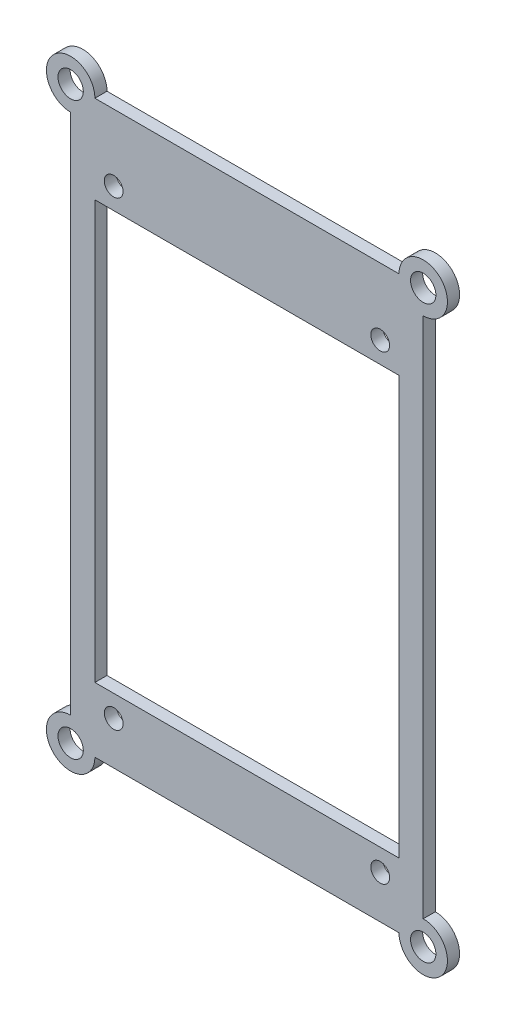
ISO-10303-21;
HEADER;
FILE_DESCRIPTION(('STEP AP214'),'2;1');
FILE_NAME('part.step','',(''),(''),'','','');
FILE_SCHEMA(('AUTOMOTIVE_DESIGN { 1 0 10303 214 1 1 1 1 }'));
ENDSEC;
DATA;
#1=APPLICATION_CONTEXT('core data for automotive mechanical design processes');
#2=APPLICATION_PROTOCOL_DEFINITION('international standard','automotive_design',2000,#1);
#3=PRODUCT_CONTEXT('',#1,'mechanical');
#4=PRODUCT('Part','Part','',(#3));
#5=PRODUCT_RELATED_PRODUCT_CATEGORY('part','',(#4));
#6=PRODUCT_DEFINITION_FORMATION('','',#4);
#7=PRODUCT_DEFINITION_CONTEXT('part definition',#1,'design');
#8=PRODUCT_DEFINITION('design','',#6,#7);
#9=PRODUCT_DEFINITION_SHAPE('','',#8);
#10=(LENGTH_UNIT() NAMED_UNIT(*) SI_UNIT(.MILLI.,.METRE.));
#11=(NAMED_UNIT(*) PLANE_ANGLE_UNIT() SI_UNIT($,.RADIAN.));
#12=(NAMED_UNIT(*) SI_UNIT($,.STERADIAN.) SOLID_ANGLE_UNIT());
#13=UNCERTAINTY_MEASURE_WITH_UNIT(LENGTH_MEASURE(1.E-05),#10,'distance_accuracy_value','');
#14=(GEOMETRIC_REPRESENTATION_CONTEXT(3) GLOBAL_UNCERTAINTY_ASSIGNED_CONTEXT((#13)) GLOBAL_UNIT_ASSIGNED_CONTEXT((#10,
#11,#12)) REPRESENTATION_CONTEXT('',''));
#15=CARTESIAN_POINT('',(0.,0.,0.));
#16=DIRECTION('',(0.,0.,1.));
#17=DIRECTION('',(1.,0.,0.));
#18=AXIS2_PLACEMENT_3D('',#15,#16,#17);
#19=CARTESIAN_POINT('',(58.3232012235346,61.2429753780309,2.));
#20=DIRECTION('',(0.,0.,1.));
#21=DIRECTION('',(1.,0.,0.));
#22=AXIS2_PLACEMENT_3D('',#19,#20,#21);
#23=PLANE('',#22);
#24=CARTESIAN_POINT('',(58.3232012235346,61.2429753780309,2.));
#25=DIRECTION('',(0.,0.,1.));
#26=DIRECTION('',(1.,0.,0.));
#27=AXIS2_PLACEMENT_3D('',#24,#25,#26);
#28=CIRCLE('',#27,2.09);
#29=CARTESIAN_POINT('',(60.4132012235346,61.2429753780309,2.));
#30=VERTEX_POINT('',#29);
#31=EDGE_CURVE('E399',#30,#30,#28,.T.);
#32=ORIENTED_EDGE('',*,*,#31,.F.);
#33=EDGE_LOOP('',(#32));
#34=FACE_BOUND('',#33,.T.);
#35=CARTESIAN_POINT('',(0.123201223641983,-32.9570246220354,2.));
#36=DIRECTION('',(0.,0.,1.));
#37=DIRECTION('',(1.,0.,0.));
#38=AXIS2_PLACEMENT_3D('',#35,#36,#37);
#39=CIRCLE('',#38,2.09);
#40=CARTESIAN_POINT('',(2.21320122364198,-32.9570246220354,2.));
#41=VERTEX_POINT('',#40);
#42=EDGE_CURVE('E400',#41,#41,#39,.T.);
#43=ORIENTED_EDGE('',*,*,#42,.F.);
#44=EDGE_LOOP('',(#43));
#45=FACE_BOUND('',#44,.T.);
#46=CARTESIAN_POINT('',(58.323201223642,-32.9570246219691,2.));
#47=DIRECTION('',(0.,0.,1.));
#48=DIRECTION('',(1.,0.,0.));
#49=AXIS2_PLACEMENT_3D('',#46,#47,#48);
#50=CIRCLE('',#49,2.09);
#51=CARTESIAN_POINT('',(60.413201223642,-32.9570246219691,2.));
#52=VERTEX_POINT('',#51);
#53=EDGE_CURVE('E404',#52,#52,#50,.T.);
#54=ORIENTED_EDGE('',*,*,#53,.F.);
#55=EDGE_LOOP('',(#54));
#56=FACE_BOUND('',#55,.T.);
#57=CARTESIAN_POINT('',(0.123201223534611,61.2429753779646,2.));
#58=DIRECTION('',(0.,0.,1.));
#59=DIRECTION('',(1.,0.,0.));
#60=AXIS2_PLACEMENT_3D('',#57,#58,#59);
#61=CIRCLE('',#60,2.09);
#62=CARTESIAN_POINT('',(2.21320122353461,61.2429753779646,2.));
#63=VERTEX_POINT('',#62);
#64=EDGE_CURVE('E248',#63,#63,#61,.T.);
#65=ORIENTED_EDGE('',*,*,#64,.F.);
#66=EDGE_LOOP('',(#65));
#67=FACE_BOUND('',#66,.T.);
#68=CARTESIAN_POINT('',(7.23306022347725,-25.8573043368635,2.));
#69=DIRECTION('',(0.,0.,1.));
#70=DIRECTION('',(1.,0.,0.));
#71=AXIS2_PLACEMENT_3D('',#68,#69,#70);
#72=CIRCLE('',#71,1.55273671485057);
#73=CARTESIAN_POINT('',(8.78579693832782,-25.8573043368635,2.));
#74=VERTEX_POINT('',#73);
#75=EDGE_CURVE('E173',#74,#74,#72,.T.);
#76=ORIENTED_EDGE('',*,*,#75,.F.);
#77=EDGE_LOOP('',(#76));
#78=FACE_BOUND('',#77,.T.);
#79=CARTESIAN_POINT('',(7.22320122359732,50.2226956632035,2.));
#80=DIRECTION('',(0.,0.,1.));
#81=DIRECTION('',(1.,0.,0.));
#82=AXIS2_PLACEMENT_3D('',#79,#80,#81);
#83=CIRCLE('',#82,1.55000000009978);
#84=CARTESIAN_POINT('',(8.7732012236971,50.2226956632035,2.));
#85=VERTEX_POINT('',#84);
#86=EDGE_CURVE('E185',#85,#85,#83,.T.);
#87=ORIENTED_EDGE('',*,*,#86,.F.);
#88=EDGE_LOOP('',(#87));
#89=FACE_BOUND('',#88,.T.);
#90=CARTESIAN_POINT('',(58.3232012235346,61.2429753780309,2.));
#91=DIRECTION('',(0.,0.,1.));
#92=DIRECTION('',(1.,0.,0.));
#93=AXIS2_PLACEMENT_3D('',#90,#91,#92);
#94=CIRCLE('',#93,3.99999999999999);
#95=CARTESIAN_POINT('',(58.3232012235392,57.2429753780309,2.));
#96=VERTEX_POINT('',#95);
#97=CARTESIAN_POINT('',(54.3232012235346,61.2429753780264,2.));
#98=VERTEX_POINT('',#97);
#99=EDGE_CURVE('E191',#96,#98,#94,.T.);
#100=ORIENTED_EDGE('',*,*,#99,.T.);
#101=DIRECTION('',(-1.,-1.13952671999624E-12,0.));
#102=VECTOR('',#101,1.);
#103=CARTESIAN_POINT('',(54.3232012235346,61.2429753780264,2.));
#104=LINE('',#103,#102);
#105=CARTESIAN_POINT('',(4.12320122353463,61.2429753779692,2.));
#106=VERTEX_POINT('',#105);
#107=EDGE_CURVE('E194',#98,#106,#104,.T.);
#108=ORIENTED_EDGE('',*,*,#107,.T.);
#109=CARTESIAN_POINT('',(0.123201223534611,61.2429753779646,2.));
#110=DIRECTION('',(0.,0.,1.));
#111=DIRECTION('',(1.,0.,0.));
#112=AXIS2_PLACEMENT_3D('',#109,#110,#111);
#113=CIRCLE('',#112,4.00000000000002);
#114=CARTESIAN_POINT('',(0.123201223539168,57.2429753779646,2.));
#115=VERTEX_POINT('',#114);
#116=EDGE_CURVE('E197',#106,#115,#113,.T.);
#117=ORIENTED_EDGE('',*,*,#116,.T.);
#118=DIRECTION('',(1.13986312473619E-12,-1.,0.));
#119=VECTOR('',#118,1.);
#120=CARTESIAN_POINT('',(0.123201223539168,57.2429753779646,2.));
#121=LINE('',#120,#119);
#122=CARTESIAN_POINT('',(0.123201223637424,-28.9570246220354,2.));
#123=VERTEX_POINT('',#122);
#124=EDGE_CURVE('E199',#115,#123,#121,.T.);
#125=ORIENTED_EDGE('',*,*,#124,.T.);
#126=CARTESIAN_POINT('',(0.123201223641983,-32.9570246220354,2.));
#127=DIRECTION('',(0.,0.,1.));
#128=DIRECTION('',(1.,0.,0.));
#129=AXIS2_PLACEMENT_3D('',#126,#127,#128);
#130=CIRCLE('',#129,4.);
#131=CARTESIAN_POINT('',(4.12320122364199,-32.9570246220354,2.));
#132=VERTEX_POINT('',#131);
#133=EDGE_CURVE('E201',#123,#132,#130,.T.);
#134=ORIENTED_EDGE('',*,*,#133,.T.);
#135=DIRECTION('',(1.,1.23047875562913E-12,0.));
#136=VECTOR('',#135,1.);
#137=CARTESIAN_POINT('',(4.12320122364199,-32.9570246220354,2.));
#138=LINE('',#137,#136);
#139=CARTESIAN_POINT('',(54.323201223642,-32.9570246219736,2.));
#140=VERTEX_POINT('',#139);
#141=EDGE_CURVE('E203',#132,#140,#138,.T.);
#142=ORIENTED_EDGE('',*,*,#141,.T.);
#143=CARTESIAN_POINT('',(58.323201223642,-32.9570246219691,2.));
#144=DIRECTION('',(0.,0.,1.));
#145=DIRECTION('',(1.,0.,0.));
#146=AXIS2_PLACEMENT_3D('',#143,#144,#145);
#147=CIRCLE('',#146,4.);
#148=CARTESIAN_POINT('',(58.3232012236374,-28.9570246219691,2.));
#149=VERTEX_POINT('',#148);
#150=EDGE_CURVE('E205',#140,#149,#147,.T.);
#151=ORIENTED_EDGE('',*,*,#150,.T.);
#152=DIRECTION('',(-1.13984614477177E-12,1.,0.));
#153=VECTOR('',#152,1.);
#154=CARTESIAN_POINT('',(58.3232012236374,-28.9570246219691,2.));
#155=LINE('',#154,#153);
#156=EDGE_CURVE('E207',#149,#96,#155,.T.);
#157=ORIENTED_EDGE('',*,*,#156,.T.);
#158=EDGE_LOOP('',(#100,#108,#117,#125,#134,#142,#151,#157));
#159=FACE_BOUND('',#158,.T.);
#160=CARTESIAN_POINT('',(51.2232012235473,50.2229753779535,2.));
#161=DIRECTION('',(0.,0.,1.));
#162=DIRECTION('',(1.,0.,0.));
#163=AXIS2_PLACEMENT_3D('',#160,#161,#162);
#164=CIRCLE('',#163,1.55000000008514);
#165=CARTESIAN_POINT('',(52.7732012236325,50.2229753779535,2.));
#166=VERTEX_POINT('',#165);
#167=EDGE_CURVE('E179',#166,#166,#164,.T.);
#168=ORIENTED_EDGE('',*,*,#167,.F.);
#169=EDGE_LOOP('',(#168));
#170=FACE_BOUND('',#169,.T.);
#171=CARTESIAN_POINT('',(51.2232012235471,-25.8570246220466,2.));
#172=DIRECTION('',(0.,0.,1.));
#173=DIRECTION('',(1.,0.,0.));
#174=AXIS2_PLACEMENT_3D('',#171,#172,#173);
#175=CIRCLE('',#174,1.54999999999999);
#176=CARTESIAN_POINT('',(52.7732012235471,-25.8570246220466,2.));
#177=VERTEX_POINT('',#176);
#178=EDGE_CURVE('E167',#177,#177,#175,.T.);
#179=ORIENTED_EDGE('',*,*,#178,.F.);
#180=EDGE_LOOP('',(#179));
#181=FACE_BOUND('',#180,.T.);
#182=DIRECTION('',(1.,0.,0.));
#183=VECTOR('',#182,1.);
#184=CARTESIAN_POINT('',(4.12320122363728,-22.2740854494614,2.));
#185=LINE('',#184,#183);
#186=CARTESIAN_POINT('',(4.12320122363728,-22.2740854494614,2.));
#187=VERTEX_POINT('',#186);
#188=CARTESIAN_POINT('',(54.3232012236373,-22.2740854494614,2.));
#189=VERTEX_POINT('',#188);
#190=EDGE_CURVE('E138',#187,#189,#185,.T.);
#191=ORIENTED_EDGE('',*,*,#190,.F.);
#192=DIRECTION('',(0.,-1.,0.));
#193=VECTOR('',#192,1.);
#194=CARTESIAN_POINT('',(4.12320122363728,46.7259145505386,2.));
#195=LINE('',#194,#193);
#196=CARTESIAN_POINT('',(4.12320122363728,46.7259145505386,2.));
#197=VERTEX_POINT('',#196);
#198=EDGE_CURVE('E130',#197,#187,#195,.T.);
#199=ORIENTED_EDGE('',*,*,#198,.F.);
#200=DIRECTION('',(-1.,0.,0.));
#201=VECTOR('',#200,1.);
#202=CARTESIAN_POINT('',(4.12320122363728,46.7259145505386,2.));
#203=LINE('',#202,#201);
#204=CARTESIAN_POINT('',(54.3232012236373,46.7259145505386,2.));
#205=VERTEX_POINT('',#204);
#206=EDGE_CURVE('E152',#205,#197,#203,.T.);
#207=ORIENTED_EDGE('',*,*,#206,.F.);
#208=DIRECTION('',(0.,1.,0.));
#209=VECTOR('',#208,1.);
#210=CARTESIAN_POINT('',(54.3232012236373,46.7259145505386,2.));
#211=LINE('',#210,#209);
#212=EDGE_CURVE('E150',#189,#205,#211,.T.);
#213=ORIENTED_EDGE('',*,*,#212,.F.);
#214=EDGE_LOOP('',(#191,#199,#207,#213));
#215=FACE_BOUND('',#214,.T.);
#216=ADVANCED_FACE('F39',(#34,#45,#56,#67,#78,#89,#159,#170,#181,#215),#23,.T.);
#217=CARTESIAN_POINT('',(58.3232012235346,61.2429753780309,0.));
#218=DIRECTION('',(0.,0.,1.));
#219=DIRECTION('',(1.,0.,0.));
#220=AXIS2_PLACEMENT_3D('',#217,#218,#219);
#221=PLANE('',#220);
#222=CARTESIAN_POINT('',(58.3232012235346,61.2429753780309,0.));
#223=DIRECTION('',(0.,0.,1.));
#224=DIRECTION('',(1.,0.,0.));
#225=AXIS2_PLACEMENT_3D('',#222,#223,#224);
#226=CIRCLE('',#225,2.09);
#227=CARTESIAN_POINT('',(60.4132012235346,61.2429753780309,0.));
#228=VERTEX_POINT('',#227);
#229=EDGE_CURVE('E43',#228,#228,#226,.T.);
#230=ORIENTED_EDGE('',*,*,#229,.T.);
#231=EDGE_LOOP('',(#230));
#232=FACE_BOUND('',#231,.T.);
#233=CARTESIAN_POINT('',(0.123201223641983,-32.9570246220354,0.));
#234=DIRECTION('',(0.,0.,1.));
#235=DIRECTION('',(1.,0.,0.));
#236=AXIS2_PLACEMENT_3D('',#233,#234,#235);
#237=CIRCLE('',#236,2.09);
#238=CARTESIAN_POINT('',(2.21320122364198,-32.9570246220354,0.));
#239=VERTEX_POINT('',#238);
#240=EDGE_CURVE('E250',#239,#239,#237,.T.);
#241=ORIENTED_EDGE('',*,*,#240,.T.);
#242=EDGE_LOOP('',(#241));
#243=FACE_BOUND('',#242,.T.);
#244=CARTESIAN_POINT('',(58.323201223642,-32.9570246219691,0.));
#245=DIRECTION('',(0.,0.,1.));
#246=DIRECTION('',(1.,0.,0.));
#247=AXIS2_PLACEMENT_3D('',#244,#245,#246);
#248=CIRCLE('',#247,2.09);
#249=CARTESIAN_POINT('',(60.413201223642,-32.9570246219691,0.));
#250=VERTEX_POINT('',#249);
#251=EDGE_CURVE('E247',#250,#250,#248,.T.);
#252=ORIENTED_EDGE('',*,*,#251,.T.);
#253=EDGE_LOOP('',(#252));
#254=FACE_BOUND('',#253,.T.);
#255=CARTESIAN_POINT('',(0.123201223534611,61.2429753779646,0.));
#256=DIRECTION('',(0.,0.,1.));
#257=DIRECTION('',(1.,0.,0.));
#258=AXIS2_PLACEMENT_3D('',#255,#256,#257);
#259=CIRCLE('',#258,2.09);
#260=CARTESIAN_POINT('',(2.21320122353461,61.2429753779646,0.));
#261=VERTEX_POINT('',#260);
#262=EDGE_CURVE('E244',#261,#261,#259,.T.);
#263=ORIENTED_EDGE('',*,*,#262,.T.);
#264=EDGE_LOOP('',(#263));
#265=FACE_BOUND('',#264,.T.);
#266=CARTESIAN_POINT('',(51.2232012235471,-25.8570246220466,0.));
#267=DIRECTION('',(0.,0.,1.));
#268=DIRECTION('',(1.,0.,0.));
#269=AXIS2_PLACEMENT_3D('',#266,#267,#268);
#270=CIRCLE('',#269,1.54999999999999);
#271=CARTESIAN_POINT('',(52.7732012235471,-25.8570246220466,0.));
#272=VERTEX_POINT('',#271);
#273=EDGE_CURVE('E146',#272,#272,#270,.T.);
#274=ORIENTED_EDGE('',*,*,#273,.T.);
#275=EDGE_LOOP('',(#274));
#276=FACE_BOUND('',#275,.T.);
#277=CARTESIAN_POINT('',(7.23306022347725,-25.8573043368635,0.));
#278=DIRECTION('',(0.,0.,1.));
#279=DIRECTION('',(1.,0.,0.));
#280=AXIS2_PLACEMENT_3D('',#277,#278,#279);
#281=CIRCLE('',#280,1.55273671485057);
#282=CARTESIAN_POINT('',(8.78579693832782,-25.8573043368635,0.));
#283=VERTEX_POINT('',#282);
#284=EDGE_CURVE('E170',#283,#283,#281,.T.);
#285=ORIENTED_EDGE('',*,*,#284,.T.);
#286=EDGE_LOOP('',(#285));
#287=FACE_BOUND('',#286,.T.);
#288=CARTESIAN_POINT('',(51.2232012235473,50.2229753779535,0.));
#289=DIRECTION('',(0.,0.,1.));
#290=DIRECTION('',(1.,0.,0.));
#291=AXIS2_PLACEMENT_3D('',#288,#289,#290);
#292=CIRCLE('',#291,1.55000000008514);
#293=CARTESIAN_POINT('',(52.7732012236325,50.2229753779535,0.));
#294=VERTEX_POINT('',#293);
#295=EDGE_CURVE('E176',#294,#294,#292,.T.);
#296=ORIENTED_EDGE('',*,*,#295,.T.);
#297=EDGE_LOOP('',(#296));
#298=FACE_BOUND('',#297,.T.);
#299=CARTESIAN_POINT('',(7.22320122359732,50.2226956632035,0.));
#300=DIRECTION('',(0.,0.,1.));
#301=DIRECTION('',(1.,0.,0.));
#302=AXIS2_PLACEMENT_3D('',#299,#300,#301);
#303=CIRCLE('',#302,1.55000000009978);
#304=CARTESIAN_POINT('',(8.7732012236971,50.2226956632035,0.));
#305=VERTEX_POINT('',#304);
#306=EDGE_CURVE('E182',#305,#305,#303,.T.);
#307=ORIENTED_EDGE('',*,*,#306,.T.);
#308=EDGE_LOOP('',(#307));
#309=FACE_BOUND('',#308,.T.);
#310=CARTESIAN_POINT('',(58.3232012235346,61.2429753780309,0.));
#311=DIRECTION('',(0.,0.,1.));
#312=DIRECTION('',(1.,0.,0.));
#313=AXIS2_PLACEMENT_3D('',#310,#311,#312);
#314=CIRCLE('',#313,3.99999999999999);
#315=CARTESIAN_POINT('',(58.3232012235392,57.2429753780309,0.));
#316=VERTEX_POINT('',#315);
#317=CARTESIAN_POINT('',(54.3232012235346,61.2429753780264,0.));
#318=VERTEX_POINT('',#317);
#319=EDGE_CURVE('E188',#316,#318,#314,.T.);
#320=ORIENTED_EDGE('',*,*,#319,.F.);
#321=DIRECTION('',(-1.13984614477177E-12,1.,0.));
#322=VECTOR('',#321,1.);
#323=CARTESIAN_POINT('',(58.3232012236374,-28.9570246219691,0.));
#324=LINE('',#323,#322);
#325=CARTESIAN_POINT('',(58.3232012236374,-28.9570246219691,0.));
#326=VERTEX_POINT('',#325);
#327=EDGE_CURVE('E195',#326,#316,#324,.T.);
#328=ORIENTED_EDGE('',*,*,#327,.F.);
#329=CARTESIAN_POINT('',(58.323201223642,-32.9570246219691,0.));
#330=DIRECTION('',(0.,0.,1.));
#331=DIRECTION('',(1.,0.,0.));
#332=AXIS2_PLACEMENT_3D('',#329,#330,#331);
#333=CIRCLE('',#332,4.);
#334=CARTESIAN_POINT('',(54.323201223642,-32.9570246219736,0.));
#335=VERTEX_POINT('',#334);
#336=EDGE_CURVE('E222',#335,#326,#333,.T.);
#337=ORIENTED_EDGE('',*,*,#336,.F.);
#338=DIRECTION('',(1.,1.23047875562913E-12,0.));
#339=VECTOR('',#338,1.);
#340=CARTESIAN_POINT('',(4.12320122364199,-32.9570246220354,0.));
#341=LINE('',#340,#339);
#342=CARTESIAN_POINT('',(4.12320122364199,-32.9570246220354,0.));
#343=VERTEX_POINT('',#342);
#344=EDGE_CURVE('E220',#343,#335,#341,.T.);
#345=ORIENTED_EDGE('',*,*,#344,.F.);
#346=CARTESIAN_POINT('',(0.123201223641983,-32.9570246220354,0.));
#347=DIRECTION('',(0.,0.,1.));
#348=DIRECTION('',(1.,0.,0.));
#349=AXIS2_PLACEMENT_3D('',#346,#347,#348);
#350=CIRCLE('',#349,4.);
#351=CARTESIAN_POINT('',(0.123201223637424,-28.9570246220354,0.));
#352=VERTEX_POINT('',#351);
#353=EDGE_CURVE('E218',#352,#343,#350,.T.);
#354=ORIENTED_EDGE('',*,*,#353,.F.);
#355=DIRECTION('',(1.13986312473619E-12,-1.,0.));
#356=VECTOR('',#355,1.);
#357=CARTESIAN_POINT('',(0.123201223539168,57.2429753779646,0.));
#358=LINE('',#357,#356);
#359=CARTESIAN_POINT('',(0.123201223539168,57.2429753779646,0.));
#360=VERTEX_POINT('',#359);
#361=EDGE_CURVE('E216',#360,#352,#358,.T.);
#362=ORIENTED_EDGE('',*,*,#361,.F.);
#363=CARTESIAN_POINT('',(0.123201223534611,61.2429753779646,0.));
#364=DIRECTION('',(0.,0.,1.));
#365=DIRECTION('',(1.,0.,0.));
#366=AXIS2_PLACEMENT_3D('',#363,#364,#365);
#367=CIRCLE('',#366,4.00000000000002);
#368=CARTESIAN_POINT('',(4.12320122353463,61.2429753779692,0.));
#369=VERTEX_POINT('',#368);
#370=EDGE_CURVE('E214',#369,#360,#367,.T.);
#371=ORIENTED_EDGE('',*,*,#370,.F.);
#372=DIRECTION('',(-1.,-1.13952671999624E-12,0.));
#373=VECTOR('',#372,1.);
#374=CARTESIAN_POINT('',(54.3232012235346,61.2429753780264,0.));
#375=LINE('',#374,#373);
#376=EDGE_CURVE('E212',#318,#369,#375,.T.);
#377=ORIENTED_EDGE('',*,*,#376,.F.);
#378=EDGE_LOOP('',(#320,#328,#337,#345,#354,#362,#371,#377));
#379=FACE_BOUND('',#378,.T.);
#380=DIRECTION('',(0.,-1.,0.));
#381=VECTOR('',#380,1.);
#382=CARTESIAN_POINT('',(4.12320122363728,46.7259145505386,0.));
#383=LINE('',#382,#381);
#384=CARTESIAN_POINT('',(4.12320122363728,46.7259145505386,0.));
#385=VERTEX_POINT('',#384);
#386=CARTESIAN_POINT('',(4.12320122363728,-22.2740854494614,0.));
#387=VERTEX_POINT('',#386);
#388=EDGE_CURVE('E64',#385,#387,#383,.T.);
#389=ORIENTED_EDGE('',*,*,#388,.T.);
#390=DIRECTION('',(1.,0.,0.));
#391=VECTOR('',#390,1.);
#392=CARTESIAN_POINT('',(4.12320122363728,-22.2740854494614,0.));
#393=LINE('',#392,#391);
#394=CARTESIAN_POINT('',(54.3232012236373,-22.2740854494614,0.));
#395=VERTEX_POINT('',#394);
#396=EDGE_CURVE('E145',#387,#395,#393,.T.);
#397=ORIENTED_EDGE('',*,*,#396,.T.);
#398=DIRECTION('',(0.,1.,0.));
#399=VECTOR('',#398,1.);
#400=CARTESIAN_POINT('',(54.3232012236373,46.7259145505386,0.));
#401=LINE('',#400,#399);
#402=CARTESIAN_POINT('',(54.3232012236373,46.7259145505386,0.));
#403=VERTEX_POINT('',#402);
#404=EDGE_CURVE('E159',#395,#403,#401,.T.);
#405=ORIENTED_EDGE('',*,*,#404,.T.);
#406=DIRECTION('',(-1.,0.,0.));
#407=VECTOR('',#406,1.);
#408=CARTESIAN_POINT('',(4.12320122363728,46.7259145505386,0.));
#409=LINE('',#408,#407);
#410=EDGE_CURVE('E139',#403,#385,#409,.T.);
#411=ORIENTED_EDGE('',*,*,#410,.T.);
#412=EDGE_LOOP('',(#389,#397,#405,#411));
#413=FACE_BOUND('',#412,.T.);
#414=ADVANCED_FACE('F257',(#232,#243,#254,#265,#276,#287,#298,#309,#379,#413),#221,.F.);
#415=CARTESIAN_POINT('',(58.3232012235346,61.2429753780309,2.));
#416=DIRECTION('',(0.,0.,-1.));
#417=DIRECTION('',(-1.,0.,0.));
#418=AXIS2_PLACEMENT_3D('',#415,#416,#417);
#419=CYLINDRICAL_SURFACE('',#418,3.99999999999999);
#420=ORIENTED_EDGE('',*,*,#319,.T.);
#421=DIRECTION('',(0.,0.,-1.));
#422=VECTOR('',#421,1.);
#423=CARTESIAN_POINT('',(54.3232012235346,61.2429753780264,2.));
#424=LINE('',#423,#422);
#425=EDGE_CURVE('E11',#98,#318,#424,.T.);
#426=ORIENTED_EDGE('',*,*,#425,.F.);
#427=ORIENTED_EDGE('',*,*,#99,.F.);
#428=DIRECTION('',(0.,0.,-1.));
#429=VECTOR('',#428,1.);
#430=CARTESIAN_POINT('',(58.3232012235392,57.2429753780309,2.));
#431=LINE('',#430,#429);
#432=EDGE_CURVE('E209',#96,#316,#431,.T.);
#433=ORIENTED_EDGE('',*,*,#432,.T.);
#434=EDGE_LOOP('',(#420,#426,#427,#433));
#435=FACE_BOUND('',#434,.T.);
#436=ADVANCED_FACE('F41',(#435),#419,.T.);
#437=CARTESIAN_POINT('',(54.3232012235346,61.2429753780264,2.));
#438=DIRECTION('',(1.13952671999624E-12,-1.,0.));
#439=DIRECTION('',(1.,1.13952671999624E-12,0.));
#440=AXIS2_PLACEMENT_3D('',#437,#438,#439);
#441=PLANE('',#440);
#442=ORIENTED_EDGE('',*,*,#376,.T.);
#443=DIRECTION('',(0.,0.,-1.));
#444=VECTOR('',#443,1.);
#445=CARTESIAN_POINT('',(4.12320122353463,61.2429753779692,2.));
#446=LINE('',#445,#444);
#447=EDGE_CURVE('E48',#106,#369,#446,.T.);
#448=ORIENTED_EDGE('',*,*,#447,.F.);
#449=ORIENTED_EDGE('',*,*,#107,.F.);
#450=ORIENTED_EDGE('',*,*,#425,.T.);
#451=EDGE_LOOP('',(#442,#448,#449,#450));
#452=FACE_BOUND('',#451,.T.);
#453=ADVANCED_FACE('F308',(#452),#441,.F.);
#454=CARTESIAN_POINT('',(0.123201223534611,61.2429753779646,2.));
#455=DIRECTION('',(0.,0.,-1.));
#456=DIRECTION('',(-1.,0.,0.));
#457=AXIS2_PLACEMENT_3D('',#454,#455,#456);
#458=CYLINDRICAL_SURFACE('',#457,4.00000000000002);
#459=ORIENTED_EDGE('',*,*,#370,.T.);
#460=DIRECTION('',(0.,0.,-1.));
#461=VECTOR('',#460,1.);
#462=CARTESIAN_POINT('',(0.123201223539168,57.2429753779646,2.));
#463=LINE('',#462,#461);
#464=EDGE_CURVE('E239',#115,#360,#463,.T.);
#465=ORIENTED_EDGE('',*,*,#464,.F.);
#466=ORIENTED_EDGE('',*,*,#116,.F.);
#467=ORIENTED_EDGE('',*,*,#447,.T.);
#468=EDGE_LOOP('',(#459,#465,#466,#467));
#469=FACE_BOUND('',#468,.T.);
#470=ADVANCED_FACE('F305',(#469),#458,.T.);
#471=CARTESIAN_POINT('',(0.123201223539168,57.2429753779646,2.));
#472=DIRECTION('',(1.,1.13986312473619E-12,0.));
#473=DIRECTION('',(-1.13986312473619E-12,1.,0.));
#474=AXIS2_PLACEMENT_3D('',#471,#472,#473);
#475=PLANE('',#474);
#476=ORIENTED_EDGE('',*,*,#361,.T.);
#477=DIRECTION('',(0.,0.,-1.));
#478=VECTOR('',#477,1.);
#479=CARTESIAN_POINT('',(0.123201223637424,-28.9570246220354,2.));
#480=LINE('',#479,#478);
#481=EDGE_CURVE('E236',#123,#352,#480,.T.);
#482=ORIENTED_EDGE('',*,*,#481,.F.);
#483=ORIENTED_EDGE('',*,*,#124,.F.);
#484=ORIENTED_EDGE('',*,*,#464,.T.);
#485=EDGE_LOOP('',(#476,#482,#483,#484));
#486=FACE_BOUND('',#485,.T.);
#487=ADVANCED_FACE('F301',(#486),#475,.F.);
#488=CARTESIAN_POINT('',(0.123201223641983,-32.9570246220354,2.));
#489=DIRECTION('',(0.,0.,-1.));
#490=DIRECTION('',(-1.,0.,0.));
#491=AXIS2_PLACEMENT_3D('',#488,#489,#490);
#492=CYLINDRICAL_SURFACE('',#491,4.);
#493=ORIENTED_EDGE('',*,*,#353,.T.);
#494=DIRECTION('',(0.,0.,-1.));
#495=VECTOR('',#494,1.);
#496=CARTESIAN_POINT('',(4.12320122364199,-32.9570246220354,2.));
#497=LINE('',#496,#495);
#498=EDGE_CURVE('E233',#132,#343,#497,.T.);
#499=ORIENTED_EDGE('',*,*,#498,.F.);
#500=ORIENTED_EDGE('',*,*,#133,.F.);
#501=ORIENTED_EDGE('',*,*,#481,.T.);
#502=EDGE_LOOP('',(#493,#499,#500,#501));
#503=FACE_BOUND('',#502,.T.);
#504=ADVANCED_FACE('F297',(#503),#492,.T.);
#505=CARTESIAN_POINT('',(4.12320122364199,-32.9570246220354,2.));
#506=DIRECTION('',(-1.23047875562913E-12,1.,0.));
#507=DIRECTION('',(-1.,-1.23047875562913E-12,0.));
#508=AXIS2_PLACEMENT_3D('',#505,#506,#507);
#509=PLANE('',#508);
#510=ORIENTED_EDGE('',*,*,#344,.T.);
#511=DIRECTION('',(0.,0.,-1.));
#512=VECTOR('',#511,1.);
#513=CARTESIAN_POINT('',(54.323201223642,-32.9570246219736,2.));
#514=LINE('',#513,#512);
#515=EDGE_CURVE('E230',#140,#335,#514,.T.);
#516=ORIENTED_EDGE('',*,*,#515,.F.);
#517=ORIENTED_EDGE('',*,*,#141,.F.);
#518=ORIENTED_EDGE('',*,*,#498,.T.);
#519=EDGE_LOOP('',(#510,#516,#517,#518));
#520=FACE_BOUND('',#519,.T.);
#521=ADVANCED_FACE('F293',(#520),#509,.F.);
#522=CARTESIAN_POINT('',(58.323201223642,-32.9570246219691,2.));
#523=DIRECTION('',(0.,0.,-1.));
#524=DIRECTION('',(-1.,0.,0.));
#525=AXIS2_PLACEMENT_3D('',#522,#523,#524);
#526=CYLINDRICAL_SURFACE('',#525,4.);
#527=ORIENTED_EDGE('',*,*,#336,.T.);
#528=DIRECTION('',(0.,0.,-1.));
#529=VECTOR('',#528,1.);
#530=CARTESIAN_POINT('',(58.3232012236374,-28.9570246219691,2.));
#531=LINE('',#530,#529);
#532=EDGE_CURVE('E227',#149,#326,#531,.T.);
#533=ORIENTED_EDGE('',*,*,#532,.F.);
#534=ORIENTED_EDGE('',*,*,#150,.F.);
#535=ORIENTED_EDGE('',*,*,#515,.T.);
#536=EDGE_LOOP('',(#527,#533,#534,#535));
#537=FACE_BOUND('',#536,.T.);
#538=ADVANCED_FACE('F289',(#537),#526,.T.);
#539=CARTESIAN_POINT('',(58.3232012236374,-28.9570246219691,2.));
#540=DIRECTION('',(-1.,-1.13984614477177E-12,0.));
#541=DIRECTION('',(1.13984614477177E-12,-1.,0.));
#542=AXIS2_PLACEMENT_3D('',#539,#540,#541);
#543=PLANE('',#542);
#544=ORIENTED_EDGE('',*,*,#327,.T.);
#545=ORIENTED_EDGE('',*,*,#432,.F.);
#546=ORIENTED_EDGE('',*,*,#156,.F.);
#547=ORIENTED_EDGE('',*,*,#532,.T.);
#548=EDGE_LOOP('',(#544,#545,#546,#547));
#549=FACE_BOUND('',#548,.T.);
#550=ADVANCED_FACE('F286',(#549),#543,.F.);
#551=CARTESIAN_POINT('',(7.22320122359732,50.2226956632035,2.));
#552=DIRECTION('',(0.,0.,-1.));
#553=DIRECTION('',(-1.,0.,0.));
#554=AXIS2_PLACEMENT_3D('',#551,#552,#553);
#555=CYLINDRICAL_SURFACE('',#554,1.55000000009978);
#556=ORIENTED_EDGE('',*,*,#86,.T.);
#557=EDGE_LOOP('',(#556));
#558=FACE_BOUND('',#557,.T.);
#559=ORIENTED_EDGE('',*,*,#306,.F.);
#560=EDGE_LOOP('',(#559));
#561=FACE_BOUND('',#560,.T.);
#562=ADVANCED_FACE('F283',(#558,#561),#555,.F.);
#563=CARTESIAN_POINT('',(51.2232012235473,50.2229753779535,2.));
#564=DIRECTION('',(0.,0.,-1.));
#565=DIRECTION('',(-1.,0.,0.));
#566=AXIS2_PLACEMENT_3D('',#563,#564,#565);
#567=CYLINDRICAL_SURFACE('',#566,1.55000000008514);
#568=ORIENTED_EDGE('',*,*,#167,.T.);
#569=EDGE_LOOP('',(#568));
#570=FACE_BOUND('',#569,.T.);
#571=ORIENTED_EDGE('',*,*,#295,.F.);
#572=EDGE_LOOP('',(#571));
#573=FACE_BOUND('',#572,.T.);
#574=ADVANCED_FACE('F361',(#570,#573),#567,.F.);
#575=CARTESIAN_POINT('',(7.23306022347725,-25.8573043368635,2.));
#576=DIRECTION('',(0.,0.,-1.));
#577=DIRECTION('',(-1.,0.,0.));
#578=AXIS2_PLACEMENT_3D('',#575,#576,#577);
#579=CYLINDRICAL_SURFACE('',#578,1.55273671485057);
#580=ORIENTED_EDGE('',*,*,#75,.T.);
#581=EDGE_LOOP('',(#580));
#582=FACE_BOUND('',#581,.T.);
#583=ORIENTED_EDGE('',*,*,#284,.F.);
#584=EDGE_LOOP('',(#583));
#585=FACE_BOUND('',#584,.T.);
#586=ADVANCED_FACE('F349',(#582,#585),#579,.F.);
#587=CARTESIAN_POINT('',(51.2232012235471,-25.8570246220466,2.));
#588=DIRECTION('',(0.,0.,-1.));
#589=DIRECTION('',(-1.,0.,0.));
#590=AXIS2_PLACEMENT_3D('',#587,#588,#589);
#591=CYLINDRICAL_SURFACE('',#590,1.54999999999999);
#592=ORIENTED_EDGE('',*,*,#178,.T.);
#593=EDGE_LOOP('',(#592));
#594=FACE_BOUND('',#593,.T.);
#595=ORIENTED_EDGE('',*,*,#273,.F.);
#596=EDGE_LOOP('',(#595));
#597=FACE_BOUND('',#596,.T.);
#598=ADVANCED_FACE('F346',(#594,#597),#591,.F.);
#599=CARTESIAN_POINT('',(4.12320122363728,46.7259145505386,2.));
#600=DIRECTION('',(1.,0.,0.));
#601=DIRECTION('',(0.,1.,0.));
#602=AXIS2_PLACEMENT_3D('',#599,#600,#601);
#603=PLANE('',#602);
#604=ORIENTED_EDGE('',*,*,#388,.F.);
#605=DIRECTION('',(0.,0.,-1.));
#606=VECTOR('',#605,1.);
#607=CARTESIAN_POINT('',(4.12320122363728,46.7259145505386,2.));
#608=LINE('',#607,#606);
#609=EDGE_CURVE('E134',#197,#385,#608,.T.);
#610=ORIENTED_EDGE('',*,*,#609,.F.);
#611=ORIENTED_EDGE('',*,*,#198,.T.);
#612=DIRECTION('',(0.,0.,-1.));
#613=VECTOR('',#612,1.);
#614=CARTESIAN_POINT('',(4.12320122363728,-22.2740854494614,2.));
#615=LINE('',#614,#613);
#616=EDGE_CURVE('E133',#187,#387,#615,.T.);
#617=ORIENTED_EDGE('',*,*,#616,.T.);
#618=EDGE_LOOP('',(#604,#610,#611,#617));
#619=FACE_BOUND('',#618,.T.);
#620=ADVANCED_FACE('F132',(#619),#603,.T.);
#621=CARTESIAN_POINT('',(4.12320122363728,-22.2740854494614,2.));
#622=DIRECTION('',(0.,1.,0.));
#623=DIRECTION('',(0.,0.,1.));
#624=AXIS2_PLACEMENT_3D('',#621,#622,#623);
#625=PLANE('',#624);
#626=ORIENTED_EDGE('',*,*,#396,.F.);
#627=ORIENTED_EDGE('',*,*,#616,.F.);
#628=ORIENTED_EDGE('',*,*,#190,.T.);
#629=DIRECTION('',(0.,0.,-1.));
#630=VECTOR('',#629,1.);
#631=CARTESIAN_POINT('',(54.3232012236373,-22.2740854494614,2.));
#632=LINE('',#631,#630);
#633=EDGE_CURVE('E147',#189,#395,#632,.T.);
#634=ORIENTED_EDGE('',*,*,#633,.T.);
#635=EDGE_LOOP('',(#626,#627,#628,#634));
#636=FACE_BOUND('',#635,.T.);
#637=ADVANCED_FACE('F142',(#636),#625,.T.);
#638=CARTESIAN_POINT('',(54.3232012236373,46.7259145505386,2.));
#639=DIRECTION('',(-1.,0.,0.));
#640=DIRECTION('',(0.,0.,1.));
#641=AXIS2_PLACEMENT_3D('',#638,#639,#640);
#642=PLANE('',#641);
#643=ORIENTED_EDGE('',*,*,#404,.F.);
#644=ORIENTED_EDGE('',*,*,#633,.F.);
#645=ORIENTED_EDGE('',*,*,#212,.T.);
#646=DIRECTION('',(0.,0.,-1.));
#647=VECTOR('',#646,1.);
#648=CARTESIAN_POINT('',(54.3232012236373,46.7259145505386,2.));
#649=LINE('',#648,#647);
#650=EDGE_CURVE('E56',#205,#403,#649,.T.);
#651=ORIENTED_EDGE('',*,*,#650,.T.);
#652=EDGE_LOOP('',(#643,#644,#645,#651));
#653=FACE_BOUND('',#652,.T.);
#654=ADVANCED_FACE('F380',(#653),#642,.T.);
#655=CARTESIAN_POINT('',(4.12320122363728,46.7259145505386,2.));
#656=DIRECTION('',(0.,-1.,0.));
#657=DIRECTION('',(1.,0.,0.));
#658=AXIS2_PLACEMENT_3D('',#655,#656,#657);
#659=PLANE('',#658);
#660=ORIENTED_EDGE('',*,*,#410,.F.);
#661=ORIENTED_EDGE('',*,*,#650,.F.);
#662=ORIENTED_EDGE('',*,*,#206,.T.);
#663=ORIENTED_EDGE('',*,*,#609,.T.);
#664=EDGE_LOOP('',(#660,#661,#662,#663));
#665=FACE_BOUND('',#664,.T.);
#666=ADVANCED_FACE('F383',(#665),#659,.T.);
#667=CARTESIAN_POINT('',(0.123201223534611,61.2429753779646,-8.));
#668=DIRECTION('',(0.,0.,1.));
#669=DIRECTION('',(1.,0.,0.));
#670=AXIS2_PLACEMENT_3D('',#667,#668,#669);
#671=CYLINDRICAL_SURFACE('',#670,2.09);
#672=ORIENTED_EDGE('',*,*,#64,.T.);
#673=EDGE_LOOP('',(#672));
#674=FACE_BOUND('',#673,.T.);
#675=ORIENTED_EDGE('',*,*,#262,.F.);
#676=EDGE_LOOP('',(#675));
#677=FACE_BOUND('',#676,.T.);
#678=ADVANCED_FACE('F386',(#674,#677),#671,.F.);
#679=CARTESIAN_POINT('',(58.323201223642,-32.9570246219691,-8.));
#680=DIRECTION('',(0.,0.,1.));
#681=DIRECTION('',(1.,0.,0.));
#682=AXIS2_PLACEMENT_3D('',#679,#680,#681);
#683=CYLINDRICAL_SURFACE('',#682,2.09);
#684=ORIENTED_EDGE('',*,*,#53,.T.);
#685=EDGE_LOOP('',(#684));
#686=FACE_BOUND('',#685,.T.);
#687=ORIENTED_EDGE('',*,*,#251,.F.);
#688=EDGE_LOOP('',(#687));
#689=FACE_BOUND('',#688,.T.);
#690=ADVANCED_FACE('F267',(#686,#689),#683,.F.);
#691=CARTESIAN_POINT('',(0.123201223641983,-32.9570246220354,-8.));
#692=DIRECTION('',(0.,0.,1.));
#693=DIRECTION('',(1.,0.,0.));
#694=AXIS2_PLACEMENT_3D('',#691,#692,#693);
#695=CYLINDRICAL_SURFACE('',#694,2.09);
#696=ORIENTED_EDGE('',*,*,#42,.T.);
#697=EDGE_LOOP('',(#696));
#698=FACE_BOUND('',#697,.T.);
#699=ORIENTED_EDGE('',*,*,#240,.F.);
#700=EDGE_LOOP('',(#699));
#701=FACE_BOUND('',#700,.T.);
#702=ADVANCED_FACE('F261',(#698,#701),#695,.F.);
#703=CARTESIAN_POINT('',(58.3232012235346,61.2429753780309,-8.));
#704=DIRECTION('',(0.,0.,1.));
#705=DIRECTION('',(1.,0.,0.));
#706=AXIS2_PLACEMENT_3D('',#703,#704,#705);
#707=CYLINDRICAL_SURFACE('',#706,2.09);
#708=ORIENTED_EDGE('',*,*,#31,.T.);
#709=EDGE_LOOP('',(#708));
#710=FACE_BOUND('',#709,.T.);
#711=ORIENTED_EDGE('',*,*,#229,.F.);
#712=EDGE_LOOP('',(#711));
#713=FACE_BOUND('',#712,.T.);
#714=ADVANCED_FACE('F259',(#710,#713),#707,.F.);
#715=CLOSED_SHELL('',(#216,#414,#436,#453,#470,#487,#504,#521,#538,#550,#562,#574,#586,#598,
#620,#637,#654,#666,#678,#690,#702,#714));
#716=MANIFOLD_SOLID_BREP('B2',#715);
#717=ADVANCED_BREP_SHAPE_REPRESENTATION('',(#18,#716),#14);
#718=SHAPE_DEFINITION_REPRESENTATION(#9,#717);
ENDSEC;
END-ISO-10303-21;
